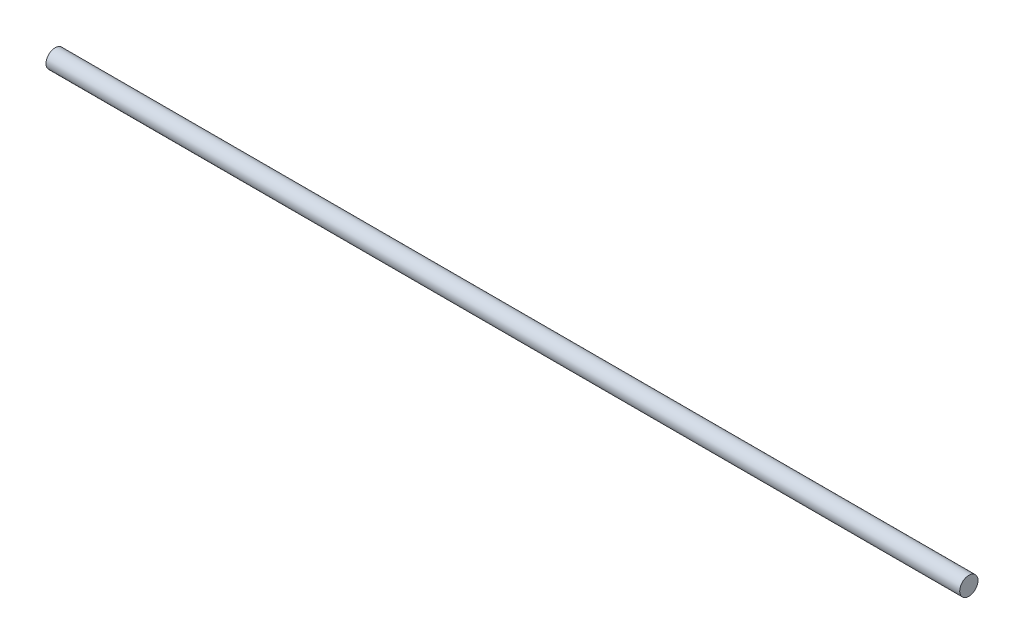
ISO-10303-21;
HEADER;
FILE_DESCRIPTION(('STEP AP214'),'2;1');
FILE_NAME('part.step','',(''),(''),'','','');
FILE_SCHEMA(('AUTOMOTIVE_DESIGN { 1 0 10303 214 1 1 1 1 }'));
ENDSEC;
DATA;
#1=APPLICATION_CONTEXT('core data for automotive mechanical design processes');
#2=APPLICATION_PROTOCOL_DEFINITION('international standard','automotive_design',2000,#1);
#3=PRODUCT_CONTEXT('',#1,'mechanical');
#4=PRODUCT('Part','Part','',(#3));
#5=PRODUCT_RELATED_PRODUCT_CATEGORY('part','',(#4));
#6=PRODUCT_DEFINITION_FORMATION('','',#4);
#7=PRODUCT_DEFINITION_CONTEXT('part definition',#1,'design');
#8=PRODUCT_DEFINITION('design','',#6,#7);
#9=PRODUCT_DEFINITION_SHAPE('','',#8);
#10=(LENGTH_UNIT() NAMED_UNIT(*) SI_UNIT(.MILLI.,.METRE.));
#11=(NAMED_UNIT(*) PLANE_ANGLE_UNIT() SI_UNIT($,.RADIAN.));
#12=(NAMED_UNIT(*) SI_UNIT($,.STERADIAN.) SOLID_ANGLE_UNIT());
#13=UNCERTAINTY_MEASURE_WITH_UNIT(LENGTH_MEASURE(1.E-05),#10,'distance_accuracy_value','');
#14=(GEOMETRIC_REPRESENTATION_CONTEXT(3) GLOBAL_UNCERTAINTY_ASSIGNED_CONTEXT((#13)) GLOBAL_UNIT_ASSIGNED_CONTEXT((#10,
#11,#12)) REPRESENTATION_CONTEXT('',''));
#15=CARTESIAN_POINT('',(0.,0.,0.));
#16=DIRECTION('',(0.,0.,1.));
#17=DIRECTION('',(1.,0.,0.));
#18=AXIS2_PLACEMENT_3D('',#15,#16,#17);
#19=CARTESIAN_POINT('',(50.,0.,0.));
#20=DIRECTION('',(-1.,0.,0.));
#21=DIRECTION('',(0.,0.,1.));
#22=AXIS2_PLACEMENT_3D('',#19,#20,#21);
#23=CYLINDRICAL_SURFACE('',#22,0.5);
#24=CARTESIAN_POINT('',(50.,0.,0.));
#25=DIRECTION('',(1.,0.,0.));
#26=DIRECTION('',(0.,0.,-1.));
#27=AXIS2_PLACEMENT_3D('',#24,#25,#26);
#28=CIRCLE('',#27,0.5);
#29=CARTESIAN_POINT('',(50.,0.,-0.5));
#30=VERTEX_POINT('',#29);
#31=EDGE_CURVE('E10',#30,#30,#28,.T.);
#32=ORIENTED_EDGE('',*,*,#31,.F.);
#33=EDGE_LOOP('',(#32));
#34=FACE_BOUND('',#33,.T.);
#35=CARTESIAN_POINT('',(0.,0.,0.));
#36=DIRECTION('',(1.,0.,0.));
#37=DIRECTION('',(0.,0.,-1.));
#38=AXIS2_PLACEMENT_3D('',#35,#36,#37);
#39=CIRCLE('',#38,0.5);
#40=CARTESIAN_POINT('',(0.,0.,-0.5));
#41=VERTEX_POINT('',#40);
#42=EDGE_CURVE('E35',#41,#41,#39,.T.);
#43=ORIENTED_EDGE('',*,*,#42,.T.);
#44=EDGE_LOOP('',(#43));
#45=FACE_BOUND('',#44,.T.);
#46=ADVANCED_FACE('F32',(#34,#45),#23,.T.);
#47=CARTESIAN_POINT('',(50.,0.,0.));
#48=DIRECTION('',(1.,0.,0.));
#49=DIRECTION('',(0.,0.,-1.));
#50=AXIS2_PLACEMENT_3D('',#47,#48,#49);
#51=PLANE('',#50);
#52=ORIENTED_EDGE('',*,*,#31,.T.);
#53=EDGE_LOOP('',(#52));
#54=FACE_BOUND('',#53,.T.);
#55=ADVANCED_FACE('F47',(#54),#51,.T.);
#56=CARTESIAN_POINT('',(0.,0.,0.));
#57=DIRECTION('',(1.,0.,0.));
#58=DIRECTION('',(0.,0.,-1.));
#59=AXIS2_PLACEMENT_3D('',#56,#57,#58);
#60=PLANE('',#59);
#61=ORIENTED_EDGE('',*,*,#42,.F.);
#62=EDGE_LOOP('',(#61));
#63=FACE_BOUND('',#62,.T.);
#64=ADVANCED_FACE('F45',(#63),#60,.F.);
#65=CLOSED_SHELL('',(#46,#55,#64));
#66=MANIFOLD_SOLID_BREP('B2',#65);
#67=ADVANCED_BREP_SHAPE_REPRESENTATION('',(#18,#66),#14);
#68=SHAPE_DEFINITION_REPRESENTATION(#9,#67);
ENDSEC;
END-ISO-10303-21;
